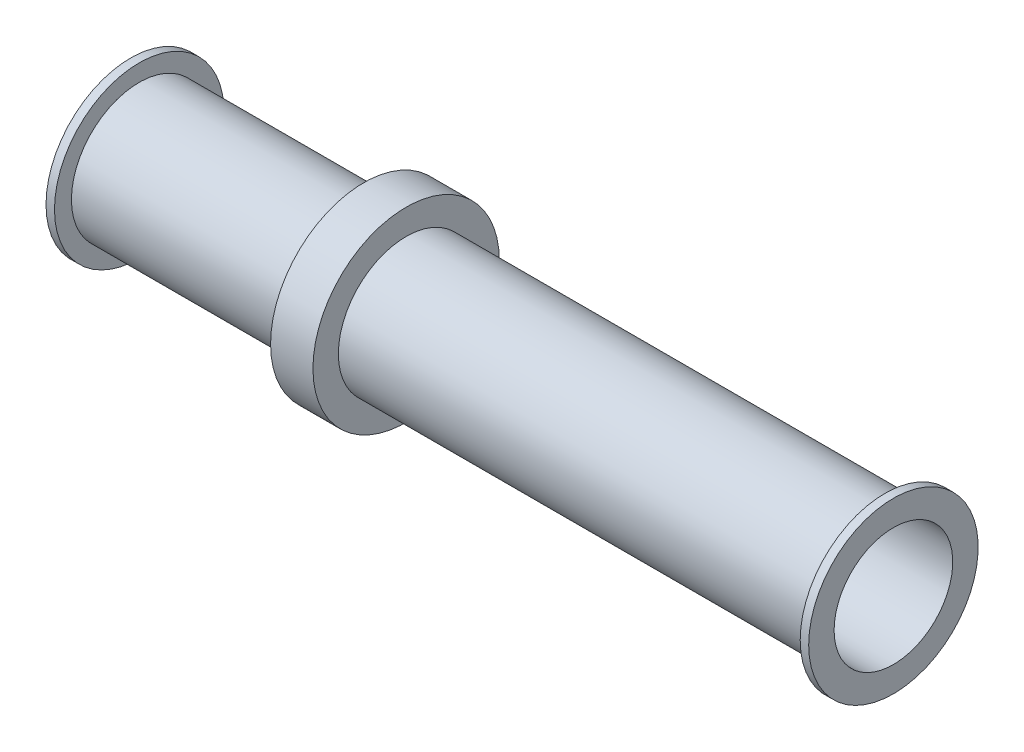
ISO-10303-21;
HEADER;
FILE_DESCRIPTION(('STEP AP214'),'2;1');
FILE_NAME('part.step','',(''),(''),'','','');
FILE_SCHEMA(('AUTOMOTIVE_DESIGN { 1 0 10303 214 1 1 1 1 }'));
ENDSEC;
DATA;
#1=APPLICATION_CONTEXT('core data for automotive mechanical design processes');
#2=APPLICATION_PROTOCOL_DEFINITION('international standard','automotive_design',2000,#1);
#3=PRODUCT_CONTEXT('',#1,'mechanical');
#4=PRODUCT('Part','Part','',(#3));
#5=PRODUCT_RELATED_PRODUCT_CATEGORY('part','',(#4));
#6=PRODUCT_DEFINITION_FORMATION('','',#4);
#7=PRODUCT_DEFINITION_CONTEXT('part definition',#1,'design');
#8=PRODUCT_DEFINITION('design','',#6,#7);
#9=PRODUCT_DEFINITION_SHAPE('','',#8);
#10=(LENGTH_UNIT() NAMED_UNIT(*) SI_UNIT(.MILLI.,.METRE.));
#11=(NAMED_UNIT(*) PLANE_ANGLE_UNIT() SI_UNIT($,.RADIAN.));
#12=(NAMED_UNIT(*) SI_UNIT($,.STERADIAN.) SOLID_ANGLE_UNIT());
#13=UNCERTAINTY_MEASURE_WITH_UNIT(LENGTH_MEASURE(1.E-05),#10,'distance_accuracy_value','');
#14=(GEOMETRIC_REPRESENTATION_CONTEXT(3) GLOBAL_UNCERTAINTY_ASSIGNED_CONTEXT((#13)) GLOBAL_UNIT_ASSIGNED_CONTEXT((#10,
#11,#12)) REPRESENTATION_CONTEXT('',''));
#15=CARTESIAN_POINT('',(0.,0.,0.));
#16=DIRECTION('',(0.,0.,1.));
#17=DIRECTION('',(1.,0.,0.));
#18=AXIS2_PLACEMENT_3D('',#15,#16,#17);
#19=CARTESIAN_POINT('',(0.,0.,0.));
#20=DIRECTION('',(-1.,0.,0.));
#21=DIRECTION('',(0.,0.,1.));
#22=AXIS2_PLACEMENT_3D('',#19,#20,#21);
#23=CYLINDRICAL_SURFACE('',#22,2.54);
#24=CARTESIAN_POINT('',(0.,0.,0.));
#25=DIRECTION('',(-1.,0.,0.));
#26=DIRECTION('',(0.,0.,1.));
#27=AXIS2_PLACEMENT_3D('',#24,#25,#26);
#28=CIRCLE('',#27,2.54);
#29=CARTESIAN_POINT('',(0.,0.,2.54));
#30=VERTEX_POINT('',#29);
#31=EDGE_CURVE('E72',#30,#30,#28,.T.);
#32=ORIENTED_EDGE('',*,*,#31,.F.);
#33=EDGE_LOOP('',(#32));
#34=FACE_BOUND('',#33,.T.);
#35=CARTESIAN_POINT('',(0.254,0.,0.));
#36=DIRECTION('',(-1.,0.,0.));
#37=DIRECTION('',(0.,0.,1.));
#38=AXIS2_PLACEMENT_3D('',#35,#36,#37);
#39=CIRCLE('',#38,2.54);
#40=CARTESIAN_POINT('',(0.254,0.,2.54));
#41=VERTEX_POINT('',#40);
#42=EDGE_CURVE('E10',#41,#41,#39,.T.);
#43=ORIENTED_EDGE('',*,*,#42,.T.);
#44=EDGE_LOOP('',(#43));
#45=FACE_BOUND('',#44,.T.);
#46=ADVANCED_FACE('F32',(#34,#45),#23,.T.);
#47=CARTESIAN_POINT('',(0.254,2.54,0.));
#48=DIRECTION('',(-1.,0.,0.));
#49=DIRECTION('',(0.,0.,1.));
#50=AXIS2_PLACEMENT_3D('',#47,#48,#49);
#51=PLANE('',#50);
#52=ORIENTED_EDGE('',*,*,#42,.F.);
#53=EDGE_LOOP('',(#52));
#54=FACE_BOUND('',#53,.T.);
#55=CARTESIAN_POINT('',(0.254,0.,0.));
#56=DIRECTION('',(-1.,0.,0.));
#57=DIRECTION('',(0.,0.,1.));
#58=AXIS2_PLACEMENT_3D('',#55,#56,#57);
#59=CIRCLE('',#58,2.032);
#60=CARTESIAN_POINT('',(0.254,0.,2.032));
#61=VERTEX_POINT('',#60);
#62=EDGE_CURVE('E38',#61,#61,#59,.T.);
#63=ORIENTED_EDGE('',*,*,#62,.T.);
#64=EDGE_LOOP('',(#63));
#65=FACE_BOUND('',#64,.T.);
#66=ADVANCED_FACE('F79',(#54,#65),#51,.F.);
#67=CARTESIAN_POINT('',(0.,0.,0.));
#68=DIRECTION('',(-1.,0.,0.));
#69=DIRECTION('',(0.,0.,1.));
#70=AXIS2_PLACEMENT_3D('',#67,#68,#69);
#71=CYLINDRICAL_SURFACE('',#70,2.032);
#72=ORIENTED_EDGE('',*,*,#62,.F.);
#73=EDGE_LOOP('',(#72));
#74=FACE_BOUND('',#73,.T.);
#75=CARTESIAN_POINT('',(6.985,0.,0.));
#76=DIRECTION('',(-1.,0.,0.));
#77=DIRECTION('',(0.,0.,1.));
#78=AXIS2_PLACEMENT_3D('',#75,#76,#77);
#79=CIRCLE('',#78,2.032);
#80=CARTESIAN_POINT('',(6.985,0.,2.032));
#81=VERTEX_POINT('',#80);
#82=EDGE_CURVE('E42',#81,#81,#79,.T.);
#83=ORIENTED_EDGE('',*,*,#82,.T.);
#84=EDGE_LOOP('',(#83));
#85=FACE_BOUND('',#84,.T.);
#86=ADVANCED_FACE('F83',(#74,#85),#71,.T.);
#87=CARTESIAN_POINT('',(6.985,2.794,0.));
#88=DIRECTION('',(1.,0.,0.));
#89=DIRECTION('',(0.,0.,-1.));
#90=AXIS2_PLACEMENT_3D('',#87,#88,#89);
#91=PLANE('',#90);
#92=ORIENTED_EDGE('',*,*,#82,.F.);
#93=EDGE_LOOP('',(#92));
#94=FACE_BOUND('',#93,.T.);
#95=CARTESIAN_POINT('',(6.985,0.,0.));
#96=DIRECTION('',(-1.,0.,0.));
#97=DIRECTION('',(0.,0.,1.));
#98=AXIS2_PLACEMENT_3D('',#95,#96,#97);
#99=CIRCLE('',#98,2.794);
#100=CARTESIAN_POINT('',(6.985,0.,2.794));
#101=VERTEX_POINT('',#100);
#102=EDGE_CURVE('E46',#101,#101,#99,.T.);
#103=ORIENTED_EDGE('',*,*,#102,.T.);
#104=EDGE_LOOP('',(#103));
#105=FACE_BOUND('',#104,.T.);
#106=ADVANCED_FACE('F88',(#94,#105),#91,.F.);
#107=CARTESIAN_POINT('',(0.,0.,0.));
#108=DIRECTION('',(-1.,0.,0.));
#109=DIRECTION('',(0.,0.,1.));
#110=AXIS2_PLACEMENT_3D('',#107,#108,#109);
#111=CYLINDRICAL_SURFACE('',#110,2.794);
#112=ORIENTED_EDGE('',*,*,#102,.F.);
#113=EDGE_LOOP('',(#112));
#114=FACE_BOUND('',#113,.T.);
#115=CARTESIAN_POINT('',(8.255,0.,0.));
#116=DIRECTION('',(-1.,0.,0.));
#117=DIRECTION('',(0.,0.,1.));
#118=AXIS2_PLACEMENT_3D('',#115,#116,#117);
#119=CIRCLE('',#118,2.794);
#120=CARTESIAN_POINT('',(8.255,0.,2.794));
#121=VERTEX_POINT('',#120);
#122=EDGE_CURVE('E51',#121,#121,#119,.T.);
#123=ORIENTED_EDGE('',*,*,#122,.T.);
#124=EDGE_LOOP('',(#123));
#125=FACE_BOUND('',#124,.T.);
#126=ADVANCED_FACE('F94',(#114,#125),#111,.T.);
#127=CARTESIAN_POINT('',(8.255,2.032,0.));
#128=DIRECTION('',(-1.,0.,0.));
#129=DIRECTION('',(0.,0.,1.));
#130=AXIS2_PLACEMENT_3D('',#127,#128,#129);
#131=PLANE('',#130);
#132=ORIENTED_EDGE('',*,*,#122,.F.);
#133=EDGE_LOOP('',(#132));
#134=FACE_BOUND('',#133,.T.);
#135=CARTESIAN_POINT('',(8.255,0.,0.));
#136=DIRECTION('',(-1.,0.,0.));
#137=DIRECTION('',(0.,0.,1.));
#138=AXIS2_PLACEMENT_3D('',#135,#136,#137);
#139=CIRCLE('',#138,2.032);
#140=CARTESIAN_POINT('',(8.255,0.,2.032));
#141=VERTEX_POINT('',#140);
#142=EDGE_CURVE('E54',#141,#141,#139,.T.);
#143=ORIENTED_EDGE('',*,*,#142,.T.);
#144=EDGE_LOOP('',(#143));
#145=FACE_BOUND('',#144,.T.);
#146=ADVANCED_FACE('F98',(#134,#145),#131,.F.);
#147=CARTESIAN_POINT('',(0.,0.,0.));
#148=DIRECTION('',(-1.,0.,0.));
#149=DIRECTION('',(0.,0.,1.));
#150=AXIS2_PLACEMENT_3D('',#147,#148,#149);
#151=CYLINDRICAL_SURFACE('',#150,2.032);
#152=ORIENTED_EDGE('',*,*,#142,.F.);
#153=EDGE_LOOP('',(#152));
#154=FACE_BOUND('',#153,.T.);
#155=CARTESIAN_POINT('',(22.606,0.,0.));
#156=DIRECTION('',(-1.,0.,0.));
#157=DIRECTION('',(0.,0.,1.));
#158=AXIS2_PLACEMENT_3D('',#155,#156,#157);
#159=CIRCLE('',#158,2.032);
#160=CARTESIAN_POINT('',(22.606,0.,2.032));
#161=VERTEX_POINT('',#160);
#162=EDGE_CURVE('E57',#161,#161,#159,.T.);
#163=ORIENTED_EDGE('',*,*,#162,.T.);
#164=EDGE_LOOP('',(#163));
#165=FACE_BOUND('',#164,.T.);
#166=ADVANCED_FACE('F102',(#154,#165),#151,.T.);
#167=CARTESIAN_POINT('',(22.606,2.032,0.));
#168=DIRECTION('',(1.,0.,0.));
#169=DIRECTION('',(0.,0.,-1.));
#170=AXIS2_PLACEMENT_3D('',#167,#168,#169);
#171=PLANE('',#170);
#172=ORIENTED_EDGE('',*,*,#162,.F.);
#173=EDGE_LOOP('',(#172));
#174=FACE_BOUND('',#173,.T.);
#175=CARTESIAN_POINT('',(22.606,0.,0.));
#176=DIRECTION('',(-1.,0.,0.));
#177=DIRECTION('',(0.,0.,1.));
#178=AXIS2_PLACEMENT_3D('',#175,#176,#177);
#179=CIRCLE('',#178,2.54);
#180=CARTESIAN_POINT('',(22.606,0.,2.54));
#181=VERTEX_POINT('',#180);
#182=EDGE_CURVE('E60',#181,#181,#179,.T.);
#183=ORIENTED_EDGE('',*,*,#182,.T.);
#184=EDGE_LOOP('',(#183));
#185=FACE_BOUND('',#184,.T.);
#186=ADVANCED_FACE('F106',(#174,#185),#171,.F.);
#187=CARTESIAN_POINT('',(0.,0.,0.));
#188=DIRECTION('',(-1.,0.,0.));
#189=DIRECTION('',(0.,0.,1.));
#190=AXIS2_PLACEMENT_3D('',#187,#188,#189);
#191=CYLINDRICAL_SURFACE('',#190,2.54);
#192=ORIENTED_EDGE('',*,*,#182,.F.);
#193=EDGE_LOOP('',(#192));
#194=FACE_BOUND('',#193,.T.);
#195=CARTESIAN_POINT('',(22.86,0.,0.));
#196=DIRECTION('',(-1.,0.,0.));
#197=DIRECTION('',(0.,0.,1.));
#198=AXIS2_PLACEMENT_3D('',#195,#196,#197);
#199=CIRCLE('',#198,2.54);
#200=CARTESIAN_POINT('',(22.86,0.,2.54));
#201=VERTEX_POINT('',#200);
#202=EDGE_CURVE('E63',#201,#201,#199,.T.);
#203=ORIENTED_EDGE('',*,*,#202,.T.);
#204=EDGE_LOOP('',(#203));
#205=FACE_BOUND('',#204,.T.);
#206=ADVANCED_FACE('F110',(#194,#205),#191,.T.);
#207=CARTESIAN_POINT('',(22.86,2.54,0.));
#208=DIRECTION('',(-1.,0.,0.));
#209=DIRECTION('',(0.,0.,1.));
#210=AXIS2_PLACEMENT_3D('',#207,#208,#209);
#211=PLANE('',#210);
#212=ORIENTED_EDGE('',*,*,#202,.F.);
#213=EDGE_LOOP('',(#212));
#214=FACE_BOUND('',#213,.T.);
#215=CARTESIAN_POINT('',(22.86,0.,0.));
#216=DIRECTION('',(-1.,0.,0.));
#217=DIRECTION('',(0.,0.,1.));
#218=AXIS2_PLACEMENT_3D('',#215,#216,#217);
#219=CIRCLE('',#218,1.778);
#220=CARTESIAN_POINT('',(22.86,0.,1.778));
#221=VERTEX_POINT('',#220);
#222=EDGE_CURVE('E66',#221,#221,#219,.T.);
#223=ORIENTED_EDGE('',*,*,#222,.T.);
#224=EDGE_LOOP('',(#223));
#225=FACE_BOUND('',#224,.T.);
#226=ADVANCED_FACE('F114',(#214,#225),#211,.F.);
#227=CARTESIAN_POINT('',(0.,0.,0.));
#228=DIRECTION('',(-1.,0.,0.));
#229=DIRECTION('',(0.,0.,1.));
#230=AXIS2_PLACEMENT_3D('',#227,#228,#229);
#231=CYLINDRICAL_SURFACE('',#230,1.778);
#232=ORIENTED_EDGE('',*,*,#222,.F.);
#233=EDGE_LOOP('',(#232));
#234=FACE_BOUND('',#233,.T.);
#235=CARTESIAN_POINT('',(0.,0.,0.));
#236=DIRECTION('',(-1.,0.,0.));
#237=DIRECTION('',(0.,0.,1.));
#238=AXIS2_PLACEMENT_3D('',#235,#236,#237);
#239=CIRCLE('',#238,1.778);
#240=CARTESIAN_POINT('',(0.,0.,1.778));
#241=VERTEX_POINT('',#240);
#242=EDGE_CURVE('E69',#241,#241,#239,.T.);
#243=ORIENTED_EDGE('',*,*,#242,.T.);
#244=EDGE_LOOP('',(#243));
#245=FACE_BOUND('',#244,.T.);
#246=ADVANCED_FACE('F118',(#234,#245),#231,.F.);
#247=CARTESIAN_POINT('',(0.,1.778,0.));
#248=DIRECTION('',(1.,0.,0.));
#249=DIRECTION('',(0.,0.,-1.));
#250=AXIS2_PLACEMENT_3D('',#247,#248,#249);
#251=PLANE('',#250);
#252=ORIENTED_EDGE('',*,*,#242,.F.);
#253=EDGE_LOOP('',(#252));
#254=FACE_BOUND('',#253,.T.);
#255=ORIENTED_EDGE('',*,*,#31,.T.);
#256=EDGE_LOOP('',(#255));
#257=FACE_BOUND('',#256,.T.);
#258=ADVANCED_FACE('F76',(#254,#257),#251,.F.);
#259=CLOSED_SHELL('',(#46,#66,#86,#106,#126,#146,#166,#186,#206,#226,#246,#258));
#260=MANIFOLD_SOLID_BREP('B2',#259);
#261=ADVANCED_BREP_SHAPE_REPRESENTATION('',(#18,#260),#14);
#262=SHAPE_DEFINITION_REPRESENTATION(#9,#261);
ENDSEC;
END-ISO-10303-21;
